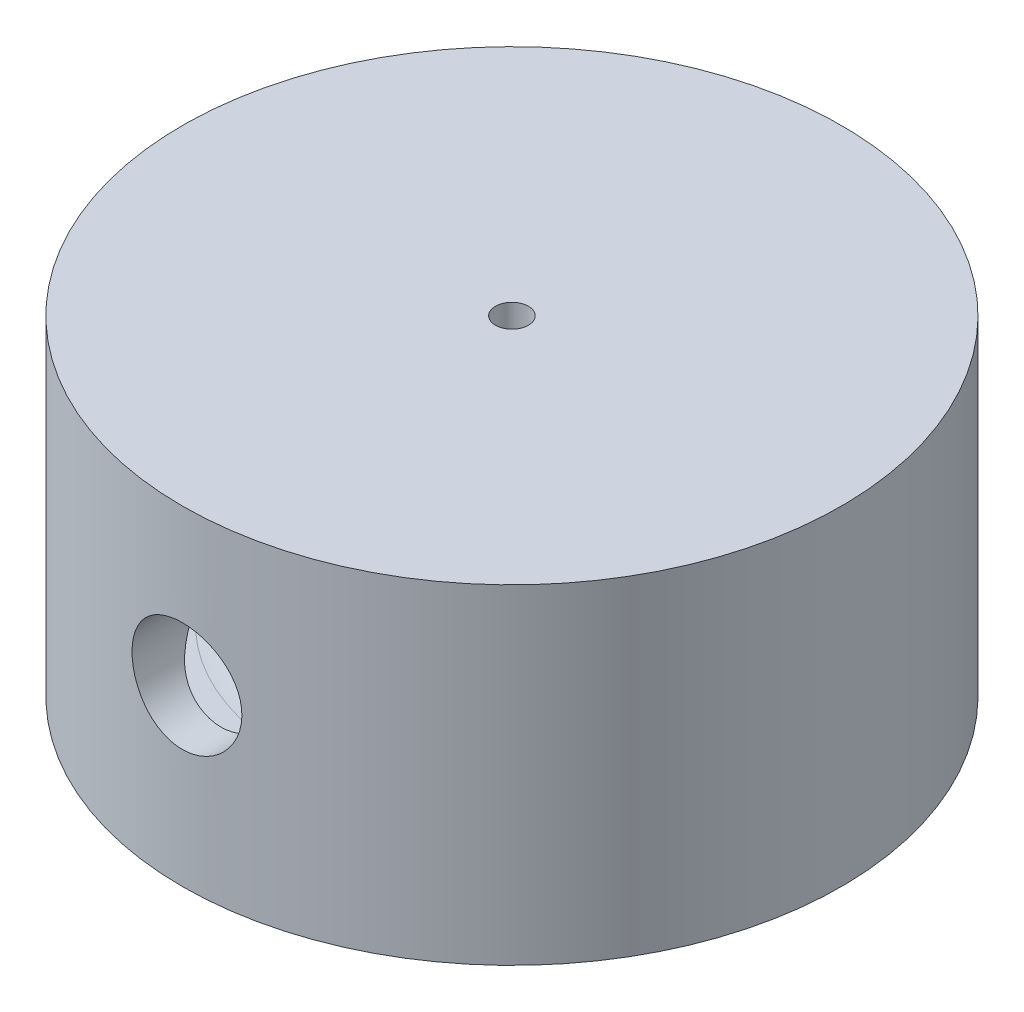
ISO-10303-21;
HEADER;
FILE_DESCRIPTION(('STEP AP214'),'2;1');
FILE_NAME('part.step','',(''),(''),'','','');
FILE_SCHEMA(('AUTOMOTIVE_DESIGN { 1 0 10303 214 1 1 1 1 }'));
ENDSEC;
DATA;
#1=APPLICATION_CONTEXT('core data for automotive mechanical design processes');
#2=APPLICATION_PROTOCOL_DEFINITION('international standard','automotive_design',2000,#1);
#3=PRODUCT_CONTEXT('',#1,'mechanical');
#4=PRODUCT('Part','Part','',(#3));
#5=PRODUCT_RELATED_PRODUCT_CATEGORY('part','',(#4));
#6=PRODUCT_DEFINITION_FORMATION('','',#4);
#7=PRODUCT_DEFINITION_CONTEXT('part definition',#1,'design');
#8=PRODUCT_DEFINITION('design','',#6,#7);
#9=PRODUCT_DEFINITION_SHAPE('','',#8);
#10=(LENGTH_UNIT() NAMED_UNIT(*) SI_UNIT(.MILLI.,.METRE.));
#11=(NAMED_UNIT(*) PLANE_ANGLE_UNIT() SI_UNIT($,.RADIAN.));
#12=(NAMED_UNIT(*) SI_UNIT($,.STERADIAN.) SOLID_ANGLE_UNIT());
#13=UNCERTAINTY_MEASURE_WITH_UNIT(LENGTH_MEASURE(1.E-05),#10,'distance_accuracy_value','');
#14=(GEOMETRIC_REPRESENTATION_CONTEXT(3) GLOBAL_UNCERTAINTY_ASSIGNED_CONTEXT((#13)) GLOBAL_UNIT_ASSIGNED_CONTEXT((#10,
#11,#12)) REPRESENTATION_CONTEXT('',''));
#15=CARTESIAN_POINT('',(0.,0.,0.));
#16=DIRECTION('',(0.,0.,1.));
#17=DIRECTION('',(1.,0.,0.));
#18=AXIS2_PLACEMENT_3D('',#15,#16,#17);
#19=CARTESIAN_POINT('',(0.,28.780364689577,0.));
#20=DIRECTION('',(0.,1.,0.));
#21=DIRECTION('',(0.,0.,1.));
#22=AXIS2_PLACEMENT_3D('',#19,#20,#21);
#23=CYLINDRICAL_SURFACE('',#22,15.);
#24=CARTESIAN_POINT('',(0.,0.0952152230582377,0.));
#25=DIRECTION('',(0.,1.,0.));
#26=DIRECTION('',(0.,0.,1.));
#27=AXIS2_PLACEMENT_3D('',#24,#25,#26);
#28=CIRCLE('',#27,15.);
#29=CARTESIAN_POINT('',(0.,0.0952152230582377,15.));
#30=VERTEX_POINT('',#29);
#31=EDGE_CURVE('E112',#30,#30,#28,.T.);
#32=ORIENTED_EDGE('',*,*,#31,.T.);
#33=EDGE_LOOP('',(#32));
#34=FACE_BOUND('',#33,.T.);
#35=CARTESIAN_POINT('',(0.,15.0952152230582,0.));
#36=DIRECTION('',(0.,1.,0.));
#37=DIRECTION('',(0.,0.,1.));
#38=AXIS2_PLACEMENT_3D('',#35,#36,#37);
#39=CIRCLE('',#38,15.);
#40=CARTESIAN_POINT('',(0.,15.0952152230582,15.));
#41=VERTEX_POINT('',#40);
#42=EDGE_CURVE('E109',#41,#41,#39,.T.);
#43=ORIENTED_EDGE('',*,*,#42,.F.);
#44=EDGE_LOOP('',(#43));
#45=FACE_BOUND('',#44,.T.);
#46=CARTESIAN_POINT('',(0.,5.5,15.));
#47=CARTESIAN_POINT('',(-0.139390904958215,5.50000558894781,14.9999976116882));
#48=CARTESIAN_POINT('',(-0.278857881838821,5.51169727496892,14.9980367791303));
#49=CARTESIAN_POINT('',(-0.553880221673043,5.55813565876532,14.9904034494139));
#50=CARTESIAN_POINT('',(-0.689431867959248,5.5929035569116,14.9847275392389));
#51=CARTESIAN_POINT('',(-0.952604747212645,5.68441544859275,14.9703006823645));
#52=CARTESIAN_POINT('',(-1.0802323684319,5.74114146564057,14.9615522515919));
#53=CARTESIAN_POINT('',(-1.32414184197795,5.87491229205239,14.9419422708207));
#54=CARTESIAN_POINT('',(-1.44042498987859,5.951954777483,14.9310809625443));
#55=CARTESIAN_POINT('',(-1.65947261429168,6.12495508382046,14.9083331745831));
#56=CARTESIAN_POINT('',(-1.76211290353497,6.22106911463613,14.8964387181486));
#57=CARTESIAN_POINT('',(-1.94988849865993,6.42914796847281,14.8730262687673));
#58=CARTESIAN_POINT('',(-2.03502269939097,6.54111379145661,14.8615082996267));
#59=CARTESIAN_POINT('',(-2.18586712560514,6.77857096619706,14.8400756575978));
#60=CARTESIAN_POINT('',(-2.251454552861,6.90414133680476,14.8301712909164));
#61=CARTESIAN_POINT('',(-2.36055836541122,7.16470956430063,14.8131978979468));
#62=CARTESIAN_POINT('',(-2.40407624156561,7.29970678367763,14.8061286801431));
#63=CARTESIAN_POINT('',(-2.46741437778481,7.57398027485654,14.7957053684276));
#64=CARTESIAN_POINT('',(-2.4874490291354,7.71320573650139,14.792317684857));
#65=CARTESIAN_POINT('',(-2.50391672528988,7.99308027688347,14.7895393893665));
#66=CARTESIAN_POINT('',(-2.500351440389,8.1337292541673,14.7901484945721));
#67=CARTESIAN_POINT('',(-2.46989509839615,8.41092786127545,14.7952642886356));
#68=CARTESIAN_POINT('',(-2.44324488188977,8.54750480354524,14.7997307331892));
#69=CARTESIAN_POINT('',(-2.36775314040345,8.81422131782914,14.8119949521101));
#70=CARTESIAN_POINT('',(-2.31891085431974,8.94436066888855,14.8197928407327));
#71=CARTESIAN_POINT('',(-2.20017724609391,9.19522882344092,14.837884793341));
#72=CARTESIAN_POINT('',(-2.13018591387971,9.31590940608123,14.8481906710733));
#73=CARTESIAN_POINT('',(-1.97121201755743,9.54390440053839,14.8701291841501));
#74=CARTESIAN_POINT('',(-1.88222792065429,9.65121773245493,14.8817619265429));
#75=CARTESIAN_POINT('',(-1.68648221215905,9.85082608580735,14.9052202787979));
#76=CARTESIAN_POINT('',(-1.57951396387313,9.94291851854008,14.9170464923165));
#77=CARTESIAN_POINT('',(-1.35153524898165,10.1078777626653,14.9394260139672));
#78=CARTESIAN_POINT('',(-1.23052469190642,10.1807444501832,14.9499793138975));
#79=CARTESIAN_POINT('',(-0.97770591616671,10.3052022271363,14.9686389289291));
#80=CARTESIAN_POINT('',(-0.84588872556466,10.3567754193313,14.9767431840745));
#81=CARTESIAN_POINT('',(-0.575298345602731,10.436994215246,14.9895750301266));
#82=CARTESIAN_POINT('',(-0.436525739179468,10.4656417369737,14.9943029035047));
#83=CARTESIAN_POINT('',(-0.157709901301623,10.4989213584611,14.9998112984269));
#84=CARTESIAN_POINT('',(-0.0177007371510103,10.5038315718056,15.0006375301278));
#85=CARTESIAN_POINT('',(0.261139772889889,10.4902386555719,14.9983747442117));
#86=CARTESIAN_POINT('',(0.39997116389204,10.4717364268663,14.9952858772412));
#87=CARTESIAN_POINT('',(0.671656175546765,10.4120751506645,14.985568269382));
#88=CARTESIAN_POINT('',(0.804540868385381,10.3710537916099,14.9789610480131));
#89=CARTESIAN_POINT('',(1.06154688486044,10.2676654818005,14.9629446445536));
#90=CARTESIAN_POINT('',(1.18566771590972,10.2052973323647,14.9535353051202));
#91=CARTESIAN_POINT('',(1.42283068946896,10.0603488753032,14.9328451630241));
#92=CARTESIAN_POINT('',(1.53576525093715,9.97759484383275,14.9215485588702));
#93=CARTESIAN_POINT('',(1.74624358550269,9.79446268461494,14.898384673919));
#94=CARTESIAN_POINT('',(1.84378623969659,9.69408327672333,14.8865173517155));
#95=CARTESIAN_POINT('',(2.021742779658,9.47730245192857,14.8634017523585));
#96=CARTESIAN_POINT('',(2.10196876111372,9.36074583448559,14.8521611613711));
#97=CARTESIAN_POINT('',(2.24170231029499,9.11564703086146,14.8317152977788));
#98=CARTESIAN_POINT('',(2.30121053476983,8.9871052247725,14.8225099606602));
#99=CARTESIAN_POINT('',(2.39753833147315,8.72221026718787,14.807234536977));
#100=CARTESIAN_POINT('',(2.43445143254795,8.58589190496951,14.8011515431106));
#101=CARTESIAN_POINT('',(2.48483545377828,8.30887987077824,14.7927771683526));
#102=CARTESIAN_POINT('',(2.49830841194617,8.16818658026795,14.7904854578272));
#103=CARTESIAN_POINT('',(2.50137286604735,7.88829483403759,14.7899673308401));
#104=CARTESIAN_POINT('',(2.49126013612519,7.74909962142471,14.7916905650565));
#105=CARTESIAN_POINT('',(2.44807983895685,7.47442075194923,14.7988978145373));
#106=CARTESIAN_POINT('',(2.41501234611248,7.33893708305813,14.8043818176121));
#107=CARTESIAN_POINT('',(2.3269744895949,7.07564156270738,14.8184735628172));
#108=CARTESIAN_POINT('',(2.27202959060044,6.94782098994397,14.8270776721967));
#109=CARTESIAN_POINT('',(2.14182700391591,6.70316433080515,14.8464436892221));
#110=CARTESIAN_POINT('',(2.06656830874856,6.58632878962786,14.857205703884));
#111=CARTESIAN_POINT('',(1.89681888437216,6.36546441689225,14.8798345404562));
#112=CARTESIAN_POINT('',(1.80211056359365,6.26160398329973,14.891712955763));
#113=CARTESIAN_POINT('',(1.59660903138023,6.07114839552506,14.9151437236084));
#114=CARTESIAN_POINT('',(1.48581211291264,5.98455723136183,14.9266960002655));
#115=CARTESIAN_POINT('',(1.25036916964028,5.83055173180005,14.9482652964222));
#116=CARTESIAN_POINT('',(1.12563278753282,5.76327396068705,14.958271162531));
#117=CARTESIAN_POINT('',(0.866513069378981,5.65073051539008,14.9755116760178));
#118=CARTESIAN_POINT('',(0.73213949483001,5.6054429189203,14.9827490817748));
#119=CARTESIAN_POINT('',(0.4977033100454,5.54799472587333,14.9920579083296));
#120=CARTESIAN_POINT('',(0.399058830298447,5.53002553038403,14.9950202727336));
#121=CARTESIAN_POINT('',(0.200289310319809,5.50602626215525,14.9989921598612));
#122=CARTESIAN_POINT('',(0.100164295608494,5.49999598386264,15.0000017162064));
#123=CARTESIAN_POINT('',(0.,5.5,15.));
#124=B_SPLINE_CURVE_WITH_KNOTS('',3,(#46,#47,#48,#49,#50,#51,#52,#53,#54,#55,#56,#57,#58,#59,
#60,#61,#62,#63,#64,#65,#66,#67,#68,#69,#70,#71,#72,#73,#74,#75,#76,#77,#78,#79,#80,#81,#82,#83,
#84,#85,#86,#87,#88,#89,#90,#91,#92,#93,#94,#95,#96,#97,#98,#99,#100,#101,#102,#103,#104,#105,
#106,#107,#108,#109,#110,#111,#112,#113,#114,#115,#116,#117,#118,#119,#120,#121,#122,#123),
.UNSPECIFIED.,.T.,.F.,(4,2,2,2,2,2,2,2,2,2,2,2,2,2,2,2,2,2,2,2,2,2,2,2,2,2,2,2,2,2,2,2,2,2,2,2,
2,2,4),(0.,0.41780658493851,0.835997545695421,1.25384686702527,1.67164841267479,
2.09302491062332,2.51442800169857,2.9384252082384,3.36239376876182,3.78246077103424,
4.20249804320887,4.61820521760409,5.03392665025382,5.45164556632558,5.86939820680574,
6.29232769911327,6.71525991635848,7.13854688915904,7.56179844521149,7.98007883491398,
8.3983431303586,8.81407807006416,9.22983635826067,9.64926825627025,10.0687306305428,
10.4925382200762,10.9163323737594,11.3383602234177,11.7603513778662,12.177079095227,
12.5938054618813,13.0100481822622,13.4263115502934,13.8475138419339,14.2688133387897,
14.693022316072,15.1168075213007,15.4170424816402,15.7172722727697),.UNSPECIFIED.);
#125=CARTESIAN_POINT('',(0.,5.5,15.));
#126=VERTEX_POINT('',#125);
#127=EDGE_CURVE('E69',#126,#126,#124,.T.);
#128=ORIENTED_EDGE('',*,*,#127,.T.);
#129=EDGE_LOOP('',(#128));
#130=FACE_BOUND('',#129,.T.);
#131=ADVANCED_FACE('F41',(#34,#45,#130),#23,.T.);
#132=CARTESIAN_POINT('',(0.,10.877459625308,0.));
#133=DIRECTION('',(0.,-1.,0.));
#134=DIRECTION('',(0.,0.,-1.));
#135=AXIS2_PLACEMENT_3D('',#132,#133,#134);
#136=CONICAL_SURFACE('',#135,10.9047061830228,0.454924096512066);
#137=CARTESIAN_POINT('',(0.,10.877459625308,0.));
#138=DIRECTION('',(0.,1.,0.));
#139=DIRECTION('',(0.,0.,1.));
#140=AXIS2_PLACEMENT_3D('',#137,#138,#139);
#141=CIRCLE('',#140,10.9047061830228);
#142=CARTESIAN_POINT('',(0.,10.877459625308,10.9047061830228));
#143=VERTEX_POINT('',#142);
#144=EDGE_CURVE('E72',#143,#143,#141,.T.);
#145=ORIENTED_EDGE('',*,*,#144,.T.);
#146=EDGE_LOOP('',(#145));
#147=FACE_BOUND('',#146,.T.);
#148=CARTESIAN_POINT('',(-2.03393968449295,6.54635308281387,12.8634267140008));
#149=CARTESIAN_POINT('',(-2.08033174284743,6.61128241701247,12.8239347099673));
#150=CARTESIAN_POINT('',(-2.12338964781458,6.67808354903777,12.7837326391469));
#151=CARTESIAN_POINT('',(-2.20273504846381,6.81499700543293,12.7023368113715));
#152=CARTESIAN_POINT('',(-2.23902404966538,6.88510858914424,12.6611432772417));
#153=CARTESIAN_POINT('',(-2.337641601772,7.09986686800204,12.5366552762369));
#154=CARTESIAN_POINT('',(-2.38968073966372,7.24888067211677,12.45248801074));
#155=CARTESIAN_POINT('',(-2.46501744843976,7.55449679368434,12.2853634331895));
#156=CARTESIAN_POINT('',(-2.48832482149871,7.71109650415724,12.2024057180337));
#157=CARTESIAN_POINT('',(-2.50486689648248,8.02806543827353,12.0407037461254));
#158=CARTESIAN_POINT('',(-2.49811209230973,8.18843332710485,11.9619580287896));
#159=CARTESIAN_POINT('',(-2.45350809058102,8.50544374665443,11.8128587376796));
#160=CARTESIAN_POINT('',(-2.41619336689346,8.66210304366057,11.742384541599));
#161=CARTESIAN_POINT('',(-2.3103763111409,8.96870631744961,11.6107891786694));
#162=CARTESIAN_POINT('',(-2.24189839587337,9.11865545090305,11.5496607392895));
#163=CARTESIAN_POINT('',(-2.08310219207674,9.39026065674376,11.4442961487113));
#164=CARTESIAN_POINT('',(-1.99577110204839,9.51323928417162,11.3989672754524));
#165=CARTESIAN_POINT('',(-1.79844057242836,9.74313259526936,11.3179129481449));
#166=CARTESIAN_POINT('',(-1.68845436256788,9.85005659151236,11.2821819172526));
#167=CARTESIAN_POINT('',(-1.46008030019706,10.0341320025219,11.2231114068367));
#168=CARTESIAN_POINT('',(-1.34337408239516,10.1131095596456,11.198938884485));
#169=CARTESIAN_POINT('',(-1.09733471027914,10.2507122282781,11.1580875724755));
#170=CARTESIAN_POINT('',(-0.968004443414905,10.3093419799509,11.1414070740625));
#171=CARTESIAN_POINT('',(-0.705699861997955,10.402212046429,11.1155183893686));
#172=CARTESIAN_POINT('',(-0.573045178667972,10.4372861764545,11.1060529319344));
#173=CARTESIAN_POINT('',(-0.30350165538763,10.4852808010808,11.0931997945035));
#174=CARTESIAN_POINT('',(-0.166613080997114,10.4982026822668,11.089811734101));
#175=CARTESIAN_POINT('',(0.106404459617161,10.5014349004803,11.0889594384404));
#176=CARTESIAN_POINT('',(0.242531308537773,10.4919160609553,11.0914504506151));
#177=CARTESIAN_POINT('',(0.511195791067905,10.4509470222638,11.1023782373791));
#178=CARTESIAN_POINT('',(0.643733528873547,10.4194974604826,11.1108148391683));
#179=CARTESIAN_POINT('',(0.901431078800703,10.3357592452038,11.1339747219367));
#180=CARTESIAN_POINT('',(1.02659285938914,10.2834761808461,11.1486963168753));
#181=CARTESIAN_POINT('',(1.26607760895888,10.1599079037915,11.1848743399218));
#182=CARTESIAN_POINT('',(1.38040110613057,10.0886236177418,11.2063304396119));
#183=CARTESIAN_POINT('',(1.59572844348789,9.92916848463482,11.2564869445957));
#184=CARTESIAN_POINT('',(1.69666045893943,9.84091234368863,11.2852241841062));
#185=CARTESIAN_POINT('',(1.88207861282507,9.65088184531779,11.3500176683778));
#186=CARTESIAN_POINT('',(1.96656355085789,9.54910650209616,11.3860744469684));
#187=CARTESIAN_POINT('',(2.11948823068798,9.33259320411194,11.4663294583193));
#188=CARTESIAN_POINT('',(2.1874376994649,9.21758110332442,11.5107198582474));
#189=CARTESIAN_POINT('',(2.30344698420081,8.98058967462868,11.6062729622887));
#190=CARTESIAN_POINT('',(2.35150222606918,8.85860875177377,11.6574372202859));
#191=CARTESIAN_POINT('',(2.43025324572015,8.60251891553358,11.7692154212665));
#192=CARTESIAN_POINT('',(2.45952786930334,8.46815286085271,11.8302372549078));
#193=CARTESIAN_POINT('',(2.49579549465631,8.19875821865768,11.957281494461));
#194=CARTESIAN_POINT('',(2.50277396572884,8.06372925649614,12.0233071327408));
#195=CARTESIAN_POINT('',(2.49486874763738,7.78213207847062,12.1655941217801));
#196=CARTESIAN_POINT('',(2.47765819500842,7.63580855898223,12.242209136548));
#197=CARTESIAN_POINT('',(2.41824086044033,7.34921732848922,12.3969383695732));
#198=CARTESIAN_POINT('',(2.376042862286,7.20894750802156,12.475052051675));
#199=CARTESIAN_POINT('',(2.28486216499244,6.98049997525296,12.6055562488925));
#200=CARTESIAN_POINT('',(2.24226669562702,6.88990029563782,12.6582542482501));
#201=CARTESIAN_POINT('',(2.14619819852608,6.71398285170271,12.7621565485921));
#202=CARTESIAN_POINT('',(2.09274156529238,6.62865737640604,12.8133629694084));
#203=CARTESIAN_POINT('',(2.03393968449295,6.54635308281387,12.8634267140008));
#204=B_SPLINE_CURVE_WITH_KNOTS('',3,(#148,#149,#150,#151,#152,#153,#154,#155,#156,#157,#158,
#159,#160,#161,#162,#163,#164,#165,#166,#167,#168,#169,#170,#171,#172,#173,#174,#175,#176,#177,
#178,#179,#180,#181,#182,#183,#184,#185,#186,#187,#188,#189,#190,#191,#192,#193,#194,#195,#196,
#197,#198,#199,#200,#201,#202,#203),.UNSPECIFIED.,.F.,.F.,(4,2,2,2,2,2,2,2,2,2,2,2,2,2,2,2,2,2,
2,2,2,2,2,2,2,2,2,4),(0.,0.266921505700794,0.533783572536669,1.06773670139603,1.60150761549639,
2.13509221905716,2.65953916192706,3.18357589885254,3.65347428755732,4.12309904742231,
4.54988411059532,4.97657178459904,5.38722324557274,5.79784900152365,6.20535909295048,
6.612857341169,7.02024634069454,7.4276154764024,7.83708808013811,8.24659055831859,
8.66705936828267,9.08762479902724,9.53711384056212,9.98689576035532,10.4830250306757,
10.9789800011525,11.317775741326,11.6560638320282),.UNSPECIFIED.);
#205=CARTESIAN_POINT('',(-2.24790361795883,6.90595734801261,12.6491505646219));
#206=VERTEX_POINT('',#205);
#207=CARTESIAN_POINT('',(2.24790361795883,6.90595734801261,12.6491505646219));
#208=VERTEX_POINT('',#207);
#209=EDGE_CURVE('E60',#206,#208,#204,.T.);
#210=ORIENTED_EDGE('',*,*,#209,.F.);
#211=CARTESIAN_POINT('',(0.,6.90595734801261,0.));
#212=DIRECTION('',(0.,1.,0.));
#213=DIRECTION('',(0.,0.,1.));
#214=AXIS2_PLACEMENT_3D('',#211,#212,#213);
#215=CIRCLE('',#214,12.8473374938976);
#216=EDGE_CURVE('E68',#208,#206,#215,.T.);
#217=ORIENTED_EDGE('',*,*,#216,.F.);
#218=EDGE_LOOP('',(#210,#217));
#219=FACE_BOUND('',#218,.T.);
#220=ADVANCED_FACE('F67',(#147,#219),#136,.F.);
#221=CARTESIAN_POINT('',(0.,5.14838082243316,0.));
#222=DIRECTION('',(0.,1.,0.));
#223=DIRECTION('',(0.,0.,1.));
#224=AXIS2_PLACEMENT_3D('',#221,#222,#223);
#225=TOROIDAL_SURFACE('',#224,9.25415996464415,4.);
#226=CARTESIAN_POINT('',(0.,5.14838082243315,0.));
#227=DIRECTION('',(0.,1.,0.));
#228=DIRECTION('',(0.,0.,1.));
#229=AXIS2_PLACEMENT_3D('',#226,#227,#228);
#230=CIRCLE('',#229,13.2541599646442);
#231=CARTESIAN_POINT('',(0.,5.14838082243315,13.2541599646442));
#232=VERTEX_POINT('',#231);
#233=EDGE_CURVE('E73',#232,#232,#230,.T.);
#234=ORIENTED_EDGE('',*,*,#233,.F.);
#235=EDGE_LOOP('',(#234));
#236=FACE_BOUND('',#235,.T.);
#237=CARTESIAN_POINT('',(2.24800094588352,6.90615734801261,12.6490338994427));
#238=CARTESIAN_POINT('',(2.22135517291733,6.8513695858455,12.6810021269646));
#239=CARTESIAN_POINT('',(2.19234998211389,6.79687709317415,12.7115255512462));
#240=CARTESIAN_POINT('',(2.12962787745423,6.68906097892162,12.769694229544));
#241=CARTESIAN_POINT('',(2.09590982534237,6.63573764332661,12.7973387854294));
#242=CARTESIAN_POINT('',(2.02379024825211,6.53087722512832,12.8497397184864));
#243=CARTESIAN_POINT('',(1.9853897938609,6.47933973765537,12.8744967533392));
#244=CARTESIAN_POINT('',(1.90405317111798,6.37864921518811,12.9211737680055));
#245=CARTESIAN_POINT('',(1.86111754002818,6.32949589875628,12.9430940831893));
#246=CARTESIAN_POINT('',(1.72556266102854,6.1862531571284,13.0048129586701));
#247=CARTESIAN_POINT('',(1.62629068886492,6.09652133623723,13.0405011658883));
#248=CARTESIAN_POINT('',(1.4127983714149,5.93309610694492,13.1018331699452));
#249=CARTESIAN_POINT('',(1.29858862685165,5.85939142258509,13.1274840388199));
#250=CARTESIAN_POINT('',(1.06167297465826,5.73275438011479,13.1695545367402));
#251=CARTESIAN_POINT('',(0.939277111838982,5.67931789588628,13.1862033102046));
#252=CARTESIAN_POINT('',(0.686814757740235,5.59248739166663,13.2124406931957));
#253=CARTESIAN_POINT('',(0.556745486868055,5.55910068401541,13.2220267271646));
#254=CARTESIAN_POINT('',(0.292157077537586,5.51348978516341,13.2349694472135));
#255=CARTESIAN_POINT('',(0.157623384653002,5.50134355884991,13.2383031869768));
#256=CARTESIAN_POINT('',(-0.111664752288777,5.49886766519128,13.2389892590637));
#257=CARTESIAN_POINT('',(-0.246419206322993,5.50853901265529,13.2363413131588));
#258=CARTESIAN_POINT('',(-0.513143688985303,5.54949125764294,13.2247763050804));
#259=CARTESIAN_POINT('',(-0.645092777219892,5.58089843652955,13.2158226021806));
#260=CARTESIAN_POINT('',(-0.901541989540311,5.6643228189806,13.1908205287087));
#261=CARTESIAN_POINT('',(-1.02604542043545,5.71633079377211,13.1747753346204));
#262=CARTESIAN_POINT('',(-1.26348267667023,5.8386651076515,13.1345444931453));
#263=CARTESIAN_POINT('',(-1.3764691262414,5.90890239526415,13.1103982565844));
#264=CARTESIAN_POINT('',(-1.58851220816776,6.06507156755899,13.05266075288));
#265=CARTESIAN_POINT('',(-1.68755904866679,6.15101438812396,13.0190628956526));
#266=CARTESIAN_POINT('',(-1.82776238488121,6.29287698250133,12.9591288466001));
#267=CARTESIAN_POINT('',(-1.87476946812898,6.34468833739153,12.9364328668505));
#268=CARTESIAN_POINT('',(-1.96365286482407,6.45117152980522,12.8878196254266));
#269=CARTESIAN_POINT('',(-2.00552798769713,6.50584402690891,12.8619016190664));
#270=CARTESIAN_POINT('',(-2.08398741810468,6.61737587216476,12.806748665806));
#271=CARTESIAN_POINT('',(-2.12056516476389,6.67423782355578,12.7775096844207));
#272=CARTESIAN_POINT('',(-2.18832845120459,6.78934032805738,12.7157422025616));
#273=CARTESIAN_POINT('',(-2.21951587969198,6.84758039012856,12.683214860649));
#274=CARTESIAN_POINT('',(-2.24800094588352,6.90615734801261,12.6490338994427));
#275=B_SPLINE_CURVE_WITH_KNOTS('',3,(#237,#238,#239,#240,#241,#242,#243,#244,#245,#246,#247,
#248,#249,#250,#251,#252,#253,#254,#255,#256,#257,#258,#259,#260,#261,#262,#263,#264,#265,#266,
#267,#268,#269,#270,#271,#272,#273,#274),.UNSPECIFIED.,.F.,.F.,(4,2,2,2,2,2,2,2,2,2,2,2,2,2,2,2,
2,2,4),(0.,0.206359506044196,0.412768938671253,0.619131265907355,0.825469173690374,
1.23868647357254,1.65161210527544,2.0534623590132,2.45545908240806,2.85892829390638,
3.2624162725089,3.6682683436016,4.07393880577568,4.47766366524233,4.88167072003553,
5.10205099347077,5.32248229699391,5.54318431496621,5.76380884400582),.UNSPECIFIED.);
#276=EDGE_CURVE('E11',#208,#206,#275,.T.);
#277=ORIENTED_EDGE('',*,*,#276,.F.);
#278=ORIENTED_EDGE('',*,*,#216,.T.);
#279=EDGE_LOOP('',(#277,#278));
#280=FACE_BOUND('',#279,.T.);
#281=ADVANCED_FACE('F71',(#236,#280),#225,.F.);
#282=CARTESIAN_POINT('',(0.,4.9208765940041,0.));
#283=DIRECTION('',(0.,1.,0.));
#284=DIRECTION('',(0.,0.,1.));
#285=AXIS2_PLACEMENT_3D('',#282,#283,#284);
#286=TOROIDAL_SURFACE('',#285,11.2541599646442,2.);
#287=CARTESIAN_POINT('',(0.,4.9208765940041,0.));
#288=DIRECTION('',(0.,1.,0.));
#289=DIRECTION('',(0.,0.,1.));
#290=AXIS2_PLACEMENT_3D('',#287,#288,#289);
#291=CIRCLE('',#290,13.2541599646442);
#292=CARTESIAN_POINT('',(0.,4.9208765940041,13.2541599646442));
#293=VERTEX_POINT('',#292);
#294=EDGE_CURVE('E79',#293,#293,#291,.T.);
#295=ORIENTED_EDGE('',*,*,#294,.T.);
#296=EDGE_LOOP('',(#295));
#297=FACE_BOUND('',#296,.T.);
#298=CARTESIAN_POINT('',(0.,2.9208765940041,0.));
#299=DIRECTION('',(0.,1.,0.));
#300=DIRECTION('',(0.,0.,1.));
#301=AXIS2_PLACEMENT_3D('',#298,#299,#300);
#302=CIRCLE('',#301,11.2541599646442);
#303=CARTESIAN_POINT('',(0.,2.9208765940041,11.2541599646442));
#304=VERTEX_POINT('',#303);
#305=EDGE_CURVE('E55',#304,#304,#302,.T.);
#306=ORIENTED_EDGE('',*,*,#305,.F.);
#307=EDGE_LOOP('',(#306));
#308=FACE_BOUND('',#307,.T.);
#309=ADVANCED_FACE('F43',(#297,#308),#286,.F.);
#310=CARTESIAN_POINT('',(0.,2.9208765940041,0.));
#311=DIRECTION('',(0.,-1.,0.));
#312=DIRECTION('',(0.,0.,-1.));
#313=AXIS2_PLACEMENT_3D('',#310,#311,#312);
#314=PLANE('',#313);
#315=CARTESIAN_POINT('',(0.,2.9208765940041,0.));
#316=DIRECTION('',(0.,1.,0.));
#317=DIRECTION('',(0.,0.,1.));
#318=AXIS2_PLACEMENT_3D('',#315,#316,#317);
#319=CIRCLE('',#318,10.1878544471122);
#320=CARTESIAN_POINT('',(0.,2.9208765940041,10.1878544471122));
#321=VERTEX_POINT('',#320);
#322=EDGE_CURVE('E127',#321,#321,#319,.T.);
#323=ORIENTED_EDGE('',*,*,#322,.F.);
#324=EDGE_LOOP('',(#323));
#325=FACE_BOUND('',#324,.T.);
#326=ORIENTED_EDGE('',*,*,#305,.T.);
#327=EDGE_LOOP('',(#326));
#328=FACE_BOUND('',#327,.T.);
#329=ADVANCED_FACE('F132',(#325,#328),#314,.F.);
#330=CARTESIAN_POINT('',(0.,8.0208765940041,0.));
#331=DIRECTION('',(0.,1.,0.));
#332=DIRECTION('',(0.,0.,1.));
#333=AXIS2_PLACEMENT_3D('',#330,#331,#332);
#334=TOROIDAL_SURFACE('',#333,10.1878544471122,5.1);
#335=CARTESIAN_POINT('',(0.,9.14173391214122,0.));
#336=DIRECTION('',(0.,1.,0.));
#337=DIRECTION('',(0.,0.,1.));
#338=AXIS2_PLACEMENT_3D('',#335,#336,#337);
#339=CIRCLE('',#338,5.21254753473193);
#340=CARTESIAN_POINT('',(0.,9.14173391214122,5.21254753473193));
#341=VERTEX_POINT('',#340);
#342=EDGE_CURVE('E124',#341,#341,#339,.T.);
#343=ORIENTED_EDGE('',*,*,#342,.F.);
#344=EDGE_LOOP('',(#343));
#345=FACE_BOUND('',#344,.T.);
#346=ORIENTED_EDGE('',*,*,#322,.T.);
#347=EDGE_LOOP('',(#346));
#348=FACE_BOUND('',#347,.T.);
#349=ADVANCED_FACE('F139',(#345,#348),#334,.F.);
#350=CARTESIAN_POINT('',(0.,9.14173391214122,0.));
#351=DIRECTION('',(0.,1.,0.));
#352=DIRECTION('',(0.,0.,1.));
#353=AXIS2_PLACEMENT_3D('',#350,#351,#352);
#354=CONICAL_SURFACE('',#353,5.21254753473193,0.221584793924795);
#355=CARTESIAN_POINT('',(0.,10.0358682777051,0.));
#356=DIRECTION('',(0.,1.,0.));
#357=DIRECTION('',(0.,0.,1.));
#358=AXIS2_PLACEMENT_3D('',#355,#356,#357);
#359=CIRCLE('',#358,5.41398175068882);
#360=CARTESIAN_POINT('',(0.,10.0358682777051,5.41398175068882));
#361=VERTEX_POINT('',#360);
#362=EDGE_CURVE('E121',#361,#361,#359,.T.);
#363=ORIENTED_EDGE('',*,*,#362,.F.);
#364=EDGE_LOOP('',(#363));
#365=FACE_BOUND('',#364,.T.);
#366=ORIENTED_EDGE('',*,*,#342,.T.);
#367=EDGE_LOOP('',(#366));
#368=FACE_BOUND('',#367,.T.);
#369=ADVANCED_FACE('F246',(#365,#368),#354,.T.);
#370=CARTESIAN_POINT('',(0.,11.0128550350882,0.));
#371=DIRECTION('',(0.,1.,0.));
#372=DIRECTION('',(0.,0.,1.));
#373=AXIS2_PLACEMENT_3D('',#370,#371,#372);
#374=TOROIDAL_SURFACE('',#373,4.3319908753444,1.45780910219086);
#375=ORIENTED_EDGE('',*,*,#362,.T.);
#376=EDGE_LOOP('',(#375));
#377=FACE_BOUND('',#376,.T.);
#378=CARTESIAN_POINT('',(0.,11.9898417924713,0.));
#379=DIRECTION('',(0.,1.,0.));
#380=DIRECTION('',(0.,0.,1.));
#381=AXIS2_PLACEMENT_3D('',#378,#379,#380);
#382=CIRCLE('',#381,3.25);
#383=CARTESIAN_POINT('',(0.,11.9898417924713,3.25));
#384=VERTEX_POINT('',#383);
#385=EDGE_CURVE('E118',#384,#384,#382,.T.);
#386=ORIENTED_EDGE('',*,*,#385,.F.);
#387=EDGE_LOOP('',(#386));
#388=FACE_BOUND('',#387,.T.);
#389=ADVANCED_FACE('F237',(#377,#388),#374,.T.);
#390=CARTESIAN_POINT('',(0.,28.780364689577,0.));
#391=DIRECTION('',(0.,1.,0.));
#392=DIRECTION('',(0.,0.,1.));
#393=AXIS2_PLACEMENT_3D('',#390,#391,#392);
#394=CYLINDRICAL_SURFACE('',#393,3.25);
#395=CARTESIAN_POINT('',(0.,0.0952152230582377,0.));
#396=DIRECTION('',(0.,1.,0.));
#397=DIRECTION('',(0.,0.,1.));
#398=AXIS2_PLACEMENT_3D('',#395,#396,#397);
#399=CIRCLE('',#398,3.25);
#400=CARTESIAN_POINT('',(0.,0.0952152230582377,3.25));
#401=VERTEX_POINT('',#400);
#402=EDGE_CURVE('E115',#401,#401,#399,.T.);
#403=ORIENTED_EDGE('',*,*,#402,.F.);
#404=EDGE_LOOP('',(#403));
#405=FACE_BOUND('',#404,.T.);
#406=ORIENTED_EDGE('',*,*,#385,.T.);
#407=EDGE_LOOP('',(#406));
#408=FACE_BOUND('',#407,.T.);
#409=ADVANCED_FACE('F229',(#405,#408),#394,.F.);
#410=CARTESIAN_POINT('',(0.,0.0952152230582377,0.));
#411=DIRECTION('',(0.,-1.,0.));
#412=DIRECTION('',(0.,0.,-1.));
#413=AXIS2_PLACEMENT_3D('',#410,#411,#412);
#414=PLANE('',#413);
#415=ORIENTED_EDGE('',*,*,#402,.T.);
#416=EDGE_LOOP('',(#415));
#417=FACE_BOUND('',#416,.T.);
#418=ORIENTED_EDGE('',*,*,#31,.F.);
#419=EDGE_LOOP('',(#418));
#420=FACE_BOUND('',#419,.T.);
#421=ADVANCED_FACE('F159',(#417,#420),#414,.T.);
#422=CARTESIAN_POINT('',(0.,15.0952152230582,0.));
#423=DIRECTION('',(0.,1.,0.));
#424=DIRECTION('',(0.,0.,1.));
#425=AXIS2_PLACEMENT_3D('',#422,#423,#424);
#426=PLANE('',#425);
#427=ORIENTED_EDGE('',*,*,#42,.T.);
#428=EDGE_LOOP('',(#427));
#429=FACE_BOUND('',#428,.T.);
#430=CARTESIAN_POINT('',(0.,15.0952152230582,0.));
#431=DIRECTION('',(0.,1.,0.));
#432=DIRECTION('',(0.,0.,1.));
#433=AXIS2_PLACEMENT_3D('',#430,#431,#432);
#434=CIRCLE('',#433,0.75);
#435=CARTESIAN_POINT('',(0.,15.0952152230582,0.75));
#436=VERTEX_POINT('',#435);
#437=EDGE_CURVE('E106',#436,#436,#434,.T.);
#438=ORIENTED_EDGE('',*,*,#437,.F.);
#439=EDGE_LOOP('',(#438));
#440=FACE_BOUND('',#439,.T.);
#441=ADVANCED_FACE('F157',(#429,#440),#426,.T.);
#442=CARTESIAN_POINT('',(0.,28.780364689577,0.));
#443=DIRECTION('',(0.,1.,0.));
#444=DIRECTION('',(0.,0.,1.));
#445=AXIS2_PLACEMENT_3D('',#442,#443,#444);
#446=CYLINDRICAL_SURFACE('',#445,0.750000000000002);
#447=ORIENTED_EDGE('',*,*,#437,.T.);
#448=EDGE_LOOP('',(#447));
#449=FACE_BOUND('',#448,.T.);
#450=CARTESIAN_POINT('',(0.,0.0952152230582377,0.));
#451=DIRECTION('',(0.,1.,0.));
#452=DIRECTION('',(0.,0.,1.));
#453=AXIS2_PLACEMENT_3D('',#450,#451,#452);
#454=CIRCLE('',#453,0.750000000000004);
#455=CARTESIAN_POINT('',(0.,0.0952152230582377,0.750000000000004));
#456=VERTEX_POINT('',#455);
#457=EDGE_CURVE('E103',#456,#456,#454,.T.);
#458=ORIENTED_EDGE('',*,*,#457,.F.);
#459=EDGE_LOOP('',(#458));
#460=FACE_BOUND('',#459,.T.);
#461=ADVANCED_FACE('F211',(#449,#460),#446,.F.);
#462=CARTESIAN_POINT('',(0.,0.0952152230582377,0.));
#463=DIRECTION('',(0.,-1.,0.));
#464=DIRECTION('',(0.,0.,-1.));
#465=AXIS2_PLACEMENT_3D('',#462,#463,#464);
#466=PLANE('',#465);
#467=ORIENTED_EDGE('',*,*,#457,.T.);
#468=EDGE_LOOP('',(#467));
#469=FACE_BOUND('',#468,.T.);
#470=CARTESIAN_POINT('',(0.,0.0952152230582377,0.));
#471=DIRECTION('',(0.,1.,0.));
#472=DIRECTION('',(0.,0.,1.));
#473=AXIS2_PLACEMENT_3D('',#470,#471,#472);
#474=CIRCLE('',#473,1.5);
#475=CARTESIAN_POINT('',(0.,0.0952152230582377,1.5));
#476=VERTEX_POINT('',#475);
#477=EDGE_CURVE('E100',#476,#476,#474,.T.);
#478=ORIENTED_EDGE('',*,*,#477,.F.);
#479=EDGE_LOOP('',(#478));
#480=FACE_BOUND('',#479,.T.);
#481=ADVANCED_FACE('F208',(#469,#480),#466,.T.);
#482=CARTESIAN_POINT('',(0.,28.780364689577,0.));
#483=DIRECTION('',(0.,1.,0.));
#484=DIRECTION('',(0.,0.,1.));
#485=AXIS2_PLACEMENT_3D('',#482,#483,#484);
#486=CYLINDRICAL_SURFACE('',#485,1.5);
#487=CARTESIAN_POINT('',(0.,12.7810394660763,0.));
#488=DIRECTION('',(0.,1.,0.));
#489=DIRECTION('',(0.,0.,1.));
#490=AXIS2_PLACEMENT_3D('',#487,#488,#489);
#491=CIRCLE('',#490,1.5);
#492=CARTESIAN_POINT('',(0.,12.7810394660763,1.5));
#493=VERTEX_POINT('',#492);
#494=EDGE_CURVE('E97',#493,#493,#491,.T.);
#495=ORIENTED_EDGE('',*,*,#494,.F.);
#496=EDGE_LOOP('',(#495));
#497=FACE_BOUND('',#496,.T.);
#498=ORIENTED_EDGE('',*,*,#477,.T.);
#499=EDGE_LOOP('',(#498));
#500=FACE_BOUND('',#499,.T.);
#501=ADVANCED_FACE('F204',(#497,#500),#486,.T.);
#502=CARTESIAN_POINT('',(0.,11.9898417924713,0.));
#503=DIRECTION('',(0.,1.,0.));
#504=DIRECTION('',(0.,0.,1.));
#505=AXIS2_PLACEMENT_3D('',#502,#503,#504);
#506=TOROIDAL_SURFACE('',#505,3.25,1.92054517226694);
#507=CARTESIAN_POINT('',(0.,13.9103869647383,0.));
#508=DIRECTION('',(0.,1.,0.));
#509=DIRECTION('',(0.,0.,1.));
#510=AXIS2_PLACEMENT_3D('',#507,#508,#509);
#511=CIRCLE('',#510,3.25);
#512=CARTESIAN_POINT('',(0.,13.9103869647383,3.25));
#513=VERTEX_POINT('',#512);
#514=EDGE_CURVE('E94',#513,#513,#511,.T.);
#515=ORIENTED_EDGE('',*,*,#514,.F.);
#516=EDGE_LOOP('',(#515));
#517=FACE_BOUND('',#516,.T.);
#518=ORIENTED_EDGE('',*,*,#494,.T.);
#519=EDGE_LOOP('',(#518));
#520=FACE_BOUND('',#519,.T.);
#521=ADVANCED_FACE('F200',(#517,#520),#506,.F.);
#522=CARTESIAN_POINT('',(0.,13.9103869647383,0.));
#523=DIRECTION('',(0.,1.,0.));
#524=DIRECTION('',(0.,0.,1.));
#525=AXIS2_PLACEMENT_3D('',#522,#523,#524);
#526=PLANE('',#525);
#527=CARTESIAN_POINT('',(0.,13.9103869647383,0.));
#528=DIRECTION('',(0.,1.,0.));
#529=DIRECTION('',(0.,0.,1.));
#530=AXIS2_PLACEMENT_3D('',#527,#528,#529);
#531=CIRCLE('',#530,4.26955459222332);
#532=CARTESIAN_POINT('',(0.,13.9103869647383,4.26955459222332));
#533=VERTEX_POINT('',#532);
#534=EDGE_CURVE('E91',#533,#533,#531,.T.);
#535=ORIENTED_EDGE('',*,*,#534,.F.);
#536=EDGE_LOOP('',(#535));
#537=FACE_BOUND('',#536,.T.);
#538=ORIENTED_EDGE('',*,*,#514,.T.);
#539=EDGE_LOOP('',(#538));
#540=FACE_BOUND('',#539,.T.);
#541=ADVANCED_FACE('F196',(#537,#540),#526,.F.);
#542=CARTESIAN_POINT('',(0.,3.91038696473827,0.));
#543=DIRECTION('',(0.,1.,0.));
#544=DIRECTION('',(0.,0.,1.));
#545=AXIS2_PLACEMENT_3D('',#542,#543,#544);
#546=DEGENERATE_TOROIDAL_SURFACE('',#545,4.26955459222335,10.,.T.);
#547=ORIENTED_EDGE('',*,*,#534,.T.);
#548=EDGE_LOOP('',(#547));
#549=FACE_BOUND('',#548,.T.);
#550=CARTESIAN_POINT('',(0.,12.9704722733796,0.));
#551=DIRECTION('',(0.,1.,0.));
#552=DIRECTION('',(0.,0.,1.));
#553=AXIS2_PLACEMENT_3D('',#550,#551,#552);
#554=CIRCLE('',#553,8.50214885580934);
#555=CARTESIAN_POINT('',(0.,12.9704722733796,8.50214885580934));
#556=VERTEX_POINT('',#555);
#557=EDGE_CURVE('E88',#556,#556,#554,.T.);
#558=ORIENTED_EDGE('',*,*,#557,.F.);
#559=EDGE_LOOP('',(#558));
#560=FACE_BOUND('',#559,.T.);
#561=ADVANCED_FACE('F192',(#549,#560),#546,.F.);
#562=CARTESIAN_POINT('',(0.,12.9704722733796,0.));
#563=DIRECTION('',(0.,-1.,0.));
#564=DIRECTION('',(0.,0.,-1.));
#565=AXIS2_PLACEMENT_3D('',#562,#563,#564);
#566=CONICAL_SURFACE('',#565,8.50214885580934,1.13375645012784);
#567=CARTESIAN_POINT('',(0.,12.92975648383,0.));
#568=DIRECTION('',(0.,1.,0.));
#569=DIRECTION('',(0.,0.,1.));
#570=AXIS2_PLACEMENT_3D('',#567,#568,#569);
#571=CIRCLE('',#570,8.58930309355478);
#572=CARTESIAN_POINT('',(0.,12.92975648383,8.58930309355478));
#573=VERTEX_POINT('',#572);
#574=EDGE_CURVE('E85',#573,#573,#571,.T.);
#575=ORIENTED_EDGE('',*,*,#574,.F.);
#576=EDGE_LOOP('',(#575));
#577=FACE_BOUND('',#576,.T.);
#578=ORIENTED_EDGE('',*,*,#557,.T.);
#579=EDGE_LOOP('',(#578));
#580=FACE_BOUND('',#579,.T.);
#581=ADVANCED_FACE('F188',(#577,#580),#566,.F.);
#582=CARTESIAN_POINT('',(0.,21.9898417924713,0.));
#583=DIRECTION('',(0.,1.,0.));
#584=DIRECTION('',(0.,0.,1.));
#585=AXIS2_PLACEMENT_3D('',#582,#583,#584);
#586=TOROIDAL_SURFACE('',#585,12.8218973571408,10.);
#587=ORIENTED_EDGE('',*,*,#574,.T.);
#588=EDGE_LOOP('',(#587));
#589=FACE_BOUND('',#588,.T.);
#590=CARTESIAN_POINT('',(0.,12.7970141547979,0.));
#591=DIRECTION('',(0.,1.,0.));
#592=DIRECTION('',(0.,0.,1.));
#593=AXIS2_PLACEMENT_3D('',#590,#591,#592);
#594=CIRCLE('',#593,8.88591971187544);
#595=CARTESIAN_POINT('',(0.,12.7970141547979,8.88591971187544));
#596=VERTEX_POINT('',#595);
#597=EDGE_CURVE('E76',#596,#596,#594,.T.);
#598=ORIENTED_EDGE('',*,*,#597,.F.);
#599=EDGE_LOOP('',(#598));
#600=FACE_BOUND('',#599,.T.);
#601=ADVANCED_FACE('F184',(#589,#600),#586,.T.);
#602=CARTESIAN_POINT('',(0.,9.11988309972859,0.));
#603=DIRECTION('',(0.,1.,0.));
#604=DIRECTION('',(0.,0.,1.));
#605=AXIS2_PLACEMENT_3D('',#602,#603,#604);
#606=TOROIDAL_SURFACE('',#605,7.31152865376931,4.);
#607=ORIENTED_EDGE('',*,*,#597,.T.);
#608=EDGE_LOOP('',(#607));
#609=FACE_BOUND('',#608,.T.);
#610=ORIENTED_EDGE('',*,*,#144,.F.);
#611=EDGE_LOOP('',(#610));
#612=FACE_BOUND('',#611,.T.);
#613=ADVANCED_FACE('F177',(#609,#612),#606,.F.);
#614=CARTESIAN_POINT('',(0.,28.780364689577,0.));
#615=DIRECTION('',(0.,1.,0.));
#616=DIRECTION('',(0.,0.,1.));
#617=AXIS2_PLACEMENT_3D('',#614,#615,#616);
#618=CYLINDRICAL_SURFACE('',#617,13.2541599646442);
#619=ORIENTED_EDGE('',*,*,#294,.F.);
#620=EDGE_LOOP('',(#619));
#621=FACE_BOUND('',#620,.T.);
#622=ORIENTED_EDGE('',*,*,#233,.T.);
#623=EDGE_LOOP('',(#622));
#624=FACE_BOUND('',#623,.T.);
#625=ADVANCED_FACE('F173',(#621,#624),#618,.F.);
#626=CARTESIAN_POINT('',(0.,8.,15.));
#627=DIRECTION('',(0.,0.,-1.));
#628=DIRECTION('',(-1.,0.,0.));
#629=AXIS2_PLACEMENT_3D('',#626,#627,#628);
#630=CYLINDRICAL_SURFACE('',#629,2.5);
#631=ORIENTED_EDGE('',*,*,#127,.F.);
#632=EDGE_LOOP('',(#631));
#633=FACE_BOUND('',#632,.T.);
#634=ORIENTED_EDGE('',*,*,#209,.T.);
#635=ORIENTED_EDGE('',*,*,#276,.T.);
#636=EDGE_LOOP('',(#634,#635));
#637=FACE_BOUND('',#636,.T.);
#638=ADVANCED_FACE('F62',(#633,#637),#630,.F.);
#639=CLOSED_SHELL('',(#131,#220,#281,#309,#329,#349,#369,#389,#409,#421,#441,#461,#481,#501,
#521,#541,#561,#581,#601,#613,#625,#638));
#640=MANIFOLD_SOLID_BREP('B2',#639);
#641=ADVANCED_BREP_SHAPE_REPRESENTATION('',(#18,#640),#14);
#642=SHAPE_DEFINITION_REPRESENTATION(#9,#641);
ENDSEC;
END-ISO-10303-21;
